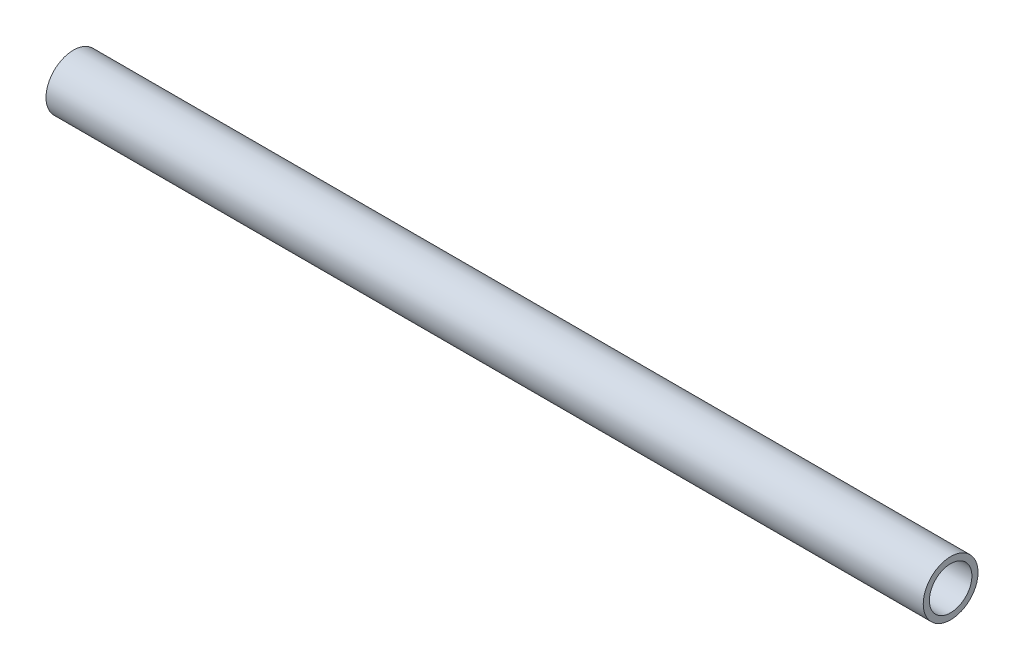
ISO-10303-21;
HEADER;
FILE_DESCRIPTION(('STEP AP214'),'2;1');
FILE_NAME('part.step','',(''),(''),'','','');
FILE_SCHEMA(('AUTOMOTIVE_DESIGN { 1 0 10303 214 1 1 1 1 }'));
ENDSEC;
DATA;
#1=APPLICATION_CONTEXT('core data for automotive mechanical design processes');
#2=APPLICATION_PROTOCOL_DEFINITION('international standard','automotive_design',2000,#1);
#3=PRODUCT_CONTEXT('',#1,'mechanical');
#4=PRODUCT('Part','Part','',(#3));
#5=PRODUCT_RELATED_PRODUCT_CATEGORY('part','',(#4));
#6=PRODUCT_DEFINITION_FORMATION('','',#4);
#7=PRODUCT_DEFINITION_CONTEXT('part definition',#1,'design');
#8=PRODUCT_DEFINITION('design','',#6,#7);
#9=PRODUCT_DEFINITION_SHAPE('','',#8);
#10=(LENGTH_UNIT() NAMED_UNIT(*) SI_UNIT(.MILLI.,.METRE.));
#11=(NAMED_UNIT(*) PLANE_ANGLE_UNIT() SI_UNIT($,.RADIAN.));
#12=(NAMED_UNIT(*) SI_UNIT($,.STERADIAN.) SOLID_ANGLE_UNIT());
#13=UNCERTAINTY_MEASURE_WITH_UNIT(LENGTH_MEASURE(1.E-05),#10,'distance_accuracy_value','');
#14=(GEOMETRIC_REPRESENTATION_CONTEXT(3) GLOBAL_UNCERTAINTY_ASSIGNED_CONTEXT((#13)) GLOBAL_UNIT_ASSIGNED_CONTEXT((#10,
#11,#12)) REPRESENTATION_CONTEXT('',''));
#15=CARTESIAN_POINT('',(0.,0.,0.));
#16=DIRECTION('',(0.,0.,1.));
#17=DIRECTION('',(1.,0.,0.));
#18=AXIS2_PLACEMENT_3D('',#15,#16,#17);
#19=CARTESIAN_POINT('',(-50.8,3.175,0.));
#20=DIRECTION('',(1.,0.,0.));
#21=DIRECTION('',(0.,0.,-1.));
#22=AXIS2_PLACEMENT_3D('',#19,#20,#21);
#23=PLANE('',#22);
#24=CARTESIAN_POINT('',(-50.8,0.,0.));
#25=DIRECTION('',(-1.,0.,0.));
#26=DIRECTION('',(0.,0.,1.));
#27=AXIS2_PLACEMENT_3D('',#24,#25,#26);
#28=CIRCLE('',#27,2.4638);
#29=CARTESIAN_POINT('',(-50.8,0.,2.4638));
#30=VERTEX_POINT('',#29);
#31=EDGE_CURVE('E10',#30,#30,#28,.T.);
#32=ORIENTED_EDGE('',*,*,#31,.F.);
#33=EDGE_LOOP('',(#32));
#34=FACE_BOUND('',#33,.T.);
#35=CARTESIAN_POINT('',(-50.8,0.,0.));
#36=DIRECTION('',(-1.,0.,0.));
#37=DIRECTION('',(0.,0.,1.));
#38=AXIS2_PLACEMENT_3D('',#35,#36,#37);
#39=CIRCLE('',#38,3.175);
#40=CARTESIAN_POINT('',(-50.8,0.,3.175));
#41=VERTEX_POINT('',#40);
#42=EDGE_CURVE('E49',#41,#41,#39,.T.);
#43=ORIENTED_EDGE('',*,*,#42,.T.);
#44=EDGE_LOOP('',(#43));
#45=FACE_BOUND('',#44,.T.);
#46=ADVANCED_FACE('F35',(#34,#45),#23,.F.);
#47=CARTESIAN_POINT('',(-50.8,0.,0.));
#48=DIRECTION('',(-1.,0.,0.));
#49=DIRECTION('',(0.,0.,1.));
#50=AXIS2_PLACEMENT_3D('',#47,#48,#49);
#51=CYLINDRICAL_SURFACE('',#50,2.4638);
#52=CARTESIAN_POINT('',(50.8,0.,0.));
#53=DIRECTION('',(-1.,0.,0.));
#54=DIRECTION('',(0.,0.,1.));
#55=AXIS2_PLACEMENT_3D('',#52,#53,#54);
#56=CIRCLE('',#55,2.4638);
#57=CARTESIAN_POINT('',(50.8,0.,2.4638));
#58=VERTEX_POINT('',#57);
#59=EDGE_CURVE('E41',#58,#58,#56,.T.);
#60=ORIENTED_EDGE('',*,*,#59,.F.);
#61=EDGE_LOOP('',(#60));
#62=FACE_BOUND('',#61,.T.);
#63=ORIENTED_EDGE('',*,*,#31,.T.);
#64=EDGE_LOOP('',(#63));
#65=FACE_BOUND('',#64,.T.);
#66=ADVANCED_FACE('F64',(#62,#65),#51,.F.);
#67=CARTESIAN_POINT('',(50.8,3.175,0.));
#68=DIRECTION('',(-1.,0.,0.));
#69=DIRECTION('',(0.,0.,1.));
#70=AXIS2_PLACEMENT_3D('',#67,#68,#69);
#71=PLANE('',#70);
#72=CARTESIAN_POINT('',(50.8,0.,0.));
#73=DIRECTION('',(-1.,0.,0.));
#74=DIRECTION('',(0.,0.,1.));
#75=AXIS2_PLACEMENT_3D('',#72,#73,#74);
#76=CIRCLE('',#75,3.175);
#77=CARTESIAN_POINT('',(50.8,0.,3.175));
#78=VERTEX_POINT('',#77);
#79=EDGE_CURVE('E45',#78,#78,#76,.T.);
#80=ORIENTED_EDGE('',*,*,#79,.F.);
#81=EDGE_LOOP('',(#80));
#82=FACE_BOUND('',#81,.T.);
#83=ORIENTED_EDGE('',*,*,#59,.T.);
#84=EDGE_LOOP('',(#83));
#85=FACE_BOUND('',#84,.T.);
#86=ADVANCED_FACE('F59',(#82,#85),#71,.F.);
#87=CARTESIAN_POINT('',(-50.8,0.,0.));
#88=DIRECTION('',(-1.,0.,0.));
#89=DIRECTION('',(0.,0.,1.));
#90=AXIS2_PLACEMENT_3D('',#87,#88,#89);
#91=CYLINDRICAL_SURFACE('',#90,3.175);
#92=ORIENTED_EDGE('',*,*,#42,.F.);
#93=EDGE_LOOP('',(#92));
#94=FACE_BOUND('',#93,.T.);
#95=ORIENTED_EDGE('',*,*,#79,.T.);
#96=EDGE_LOOP('',(#95));
#97=FACE_BOUND('',#96,.T.);
#98=ADVANCED_FACE('F56',(#94,#97),#91,.T.);
#99=CLOSED_SHELL('',(#46,#66,#86,#98));
#100=MANIFOLD_SOLID_BREP('B2',#99);
#101=ADVANCED_BREP_SHAPE_REPRESENTATION('',(#18,#100),#14);
#102=SHAPE_DEFINITION_REPRESENTATION(#9,#101);
ENDSEC;
END-ISO-10303-21;
